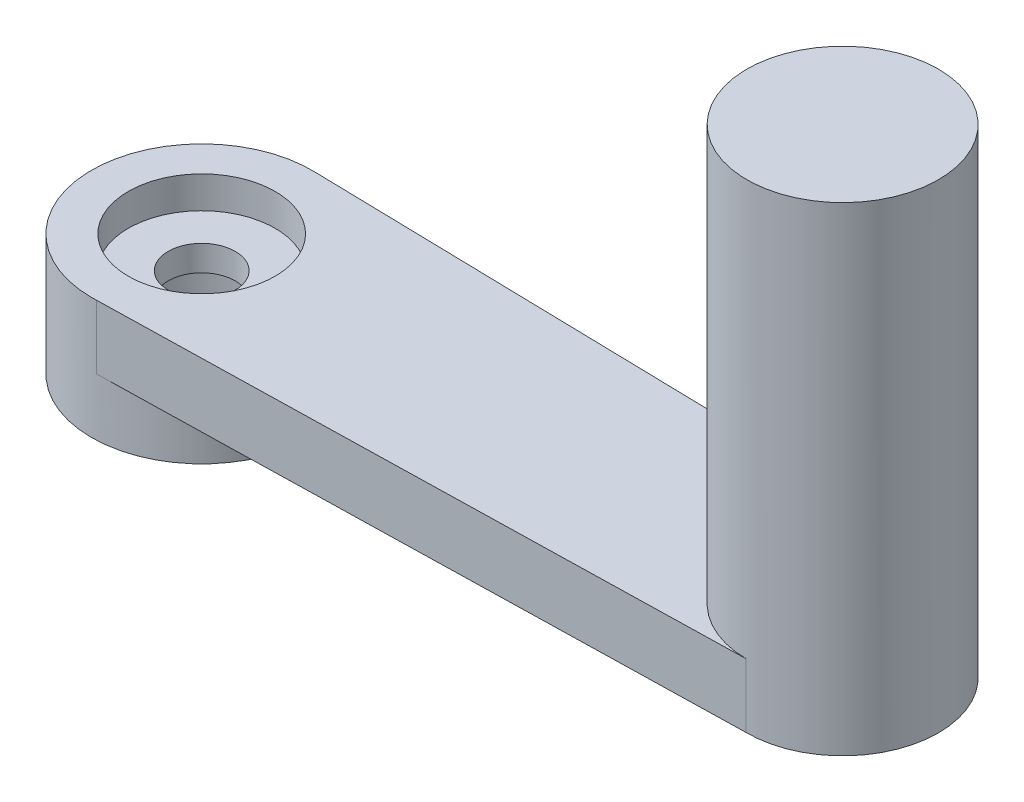
ISO-10303-21;
HEADER;
FILE_DESCRIPTION(('STEP AP214'),'2;1');
FILE_NAME('part.step','',(''),(''),'','','');
FILE_SCHEMA(('AUTOMOTIVE_DESIGN { 1 0 10303 214 1 1 1 1 }'));
ENDSEC;
DATA;
#1=APPLICATION_CONTEXT('core data for automotive mechanical design processes');
#2=APPLICATION_PROTOCOL_DEFINITION('international standard','automotive_design',2000,#1);
#3=PRODUCT_CONTEXT('',#1,'mechanical');
#4=PRODUCT('Part','Part','',(#3));
#5=PRODUCT_RELATED_PRODUCT_CATEGORY('part','',(#4));
#6=PRODUCT_DEFINITION_FORMATION('','',#4);
#7=PRODUCT_DEFINITION_CONTEXT('part definition',#1,'design');
#8=PRODUCT_DEFINITION('design','',#6,#7);
#9=PRODUCT_DEFINITION_SHAPE('','',#8);
#10=(LENGTH_UNIT() NAMED_UNIT(*) SI_UNIT(.MILLI.,.METRE.));
#11=(NAMED_UNIT(*) PLANE_ANGLE_UNIT() SI_UNIT($,.RADIAN.));
#12=(NAMED_UNIT(*) SI_UNIT($,.STERADIAN.) SOLID_ANGLE_UNIT());
#13=UNCERTAINTY_MEASURE_WITH_UNIT(LENGTH_MEASURE(1.E-05),#10,'distance_accuracy_value','');
#14=(GEOMETRIC_REPRESENTATION_CONTEXT(3) GLOBAL_UNCERTAINTY_ASSIGNED_CONTEXT((#13)) GLOBAL_UNIT_ASSIGNED_CONTEXT((#10,
#11,#12)) REPRESENTATION_CONTEXT('',''));
#15=CARTESIAN_POINT('',(0.,0.,0.));
#16=DIRECTION('',(0.,0.,1.));
#17=DIRECTION('',(1.,0.,0.));
#18=AXIS2_PLACEMENT_3D('',#15,#16,#17);
#19=CARTESIAN_POINT('',(0.,-1.4,0.));
#20=DIRECTION('',(0.,1.,0.));
#21=DIRECTION('',(0.,0.,1.));
#22=AXIS2_PLACEMENT_3D('',#19,#20,#21);
#23=CYLINDRICAL_SURFACE('',#22,3.45);
#24=DIRECTION('',(0.,1.,0.));
#25=VECTOR('',#24,1.);
#26=CARTESIAN_POINT('',(0.154910768884005,-2.,3.446520368964));
#27=LINE('',#26,#25);
#28=CARTESIAN_POINT('',(0.154910768884005,-2.,3.446520368964));
#29=VERTEX_POINT('',#28);
#30=CARTESIAN_POINT('',(0.154910768884005,0.,3.446520368964));
#31=VERTEX_POINT('',#30);
#32=EDGE_CURVE('E64',#29,#31,#27,.T.);
#33=ORIENTED_EDGE('',*,*,#32,.T.);
#34=CARTESIAN_POINT('',(0.,0.,0.));
#35=DIRECTION('',(0.,1.,0.));
#36=DIRECTION('',(0.,0.,1.));
#37=AXIS2_PLACEMENT_3D('',#34,#35,#36);
#38=CIRCLE('',#37,3.45);
#39=CARTESIAN_POINT('',(0.154910768884049,0.,-3.446520368964));
#40=VERTEX_POINT('',#39);
#41=EDGE_CURVE('E12',#40,#31,#38,.T.);
#42=ORIENTED_EDGE('',*,*,#41,.F.);
#43=DIRECTION('',(0.,1.,0.));
#44=VECTOR('',#43,1.);
#45=CARTESIAN_POINT('',(0.154910768884005,-2.,-3.446520368964));
#46=LINE('',#45,#44);
#47=CARTESIAN_POINT('',(0.154910768884005,-2.,-3.446520368964));
#48=VERTEX_POINT('',#47);
#49=EDGE_CURVE('E102',#48,#40,#46,.T.);
#50=ORIENTED_EDGE('',*,*,#49,.F.);
#51=CARTESIAN_POINT('',(0.,-2.,0.));
#52=DIRECTION('',(0.,1.,0.));
#53=DIRECTION('',(0.,0.,1.));
#54=AXIS2_PLACEMENT_3D('',#51,#52,#53);
#55=CIRCLE('',#54,3.45);
#56=EDGE_CURVE('E103',#29,#48,#55,.T.);
#57=ORIENTED_EDGE('',*,*,#56,.F.);
#58=EDGE_LOOP('',(#33,#42,#50,#57));
#59=FACE_BOUND('',#58,.T.);
#60=CARTESIAN_POINT('',(0.,-3.8,0.));
#61=DIRECTION('',(0.,1.,0.));
#62=DIRECTION('',(0.,0.,1.));
#63=AXIS2_PLACEMENT_3D('',#60,#61,#62);
#64=CIRCLE('',#63,3.45);
#65=CARTESIAN_POINT('',(0.,-3.8,3.45));
#66=VERTEX_POINT('',#65);
#67=EDGE_CURVE('E49',#66,#66,#64,.T.);
#68=ORIENTED_EDGE('',*,*,#67,.T.);
#69=EDGE_LOOP('',(#68));
#70=FACE_BOUND('',#69,.T.);
#71=ADVANCED_FACE('F41',(#59,#70),#23,.T.);
#72=CARTESIAN_POINT('',(0.,0.,0.));
#73=DIRECTION('',(0.,1.,0.));
#74=DIRECTION('',(0.,0.,1.));
#75=AXIS2_PLACEMENT_3D('',#72,#73,#74);
#76=PLANE('',#75);
#77=CARTESIAN_POINT('',(20.0673694973811,0.,0.));
#78=DIRECTION('',(0.,1.,0.));
#79=DIRECTION('',(0.,0.,1.));
#80=AXIS2_PLACEMENT_3D('',#77,#78,#79);
#81=CIRCLE('',#80,3.);
#82=CARTESIAN_POINT('',(20.0394661995052,0.,-2.9998702315213));
#83=VERTEX_POINT('',#82);
#84=CARTESIAN_POINT('',(20.0394661995052,0.,2.9998702315213));
#85=VERTEX_POINT('',#84);
#86=EDGE_CURVE('E79',#83,#85,#81,.T.);
#87=ORIENTED_EDGE('',*,*,#86,.F.);
#88=DIRECTION('',(0.999747821026361,0.,0.0224564991270473));
#89=VECTOR('',#88,1.);
#90=CARTESIAN_POINT('',(0.0774553844420034,0.,-3.448260184482));
#91=LINE('',#90,#89);
#92=EDGE_CURVE('E55',#40,#83,#91,.T.);
#93=ORIENTED_EDGE('',*,*,#92,.F.);
#94=ORIENTED_EDGE('',*,*,#41,.T.);
#95=DIRECTION('',(0.999747821026361,0.,-0.0224564991270473));
#96=VECTOR('',#95,1.);
#97=CARTESIAN_POINT('',(0.0774553844420034,0.,3.448260184482));
#98=LINE('',#97,#96);
#99=EDGE_CURVE('E73',#31,#85,#98,.T.);
#100=ORIENTED_EDGE('',*,*,#99,.T.);
#101=EDGE_LOOP('',(#87,#93,#94,#100));
#102=FACE_BOUND('',#101,.T.);
#103=CARTESIAN_POINT('',(0.,0.,0.));
#104=DIRECTION('',(0.,1.,0.));
#105=DIRECTION('',(0.,0.,1.));
#106=AXIS2_PLACEMENT_3D('',#103,#104,#105);
#107=CIRCLE('',#106,2.30000000000001);
#108=CARTESIAN_POINT('',(0.,0.,2.30000000000001));
#109=VERTEX_POINT('',#108);
#110=EDGE_CURVE('E115',#109,#109,#107,.T.);
#111=ORIENTED_EDGE('',*,*,#110,.F.);
#112=EDGE_LOOP('',(#111));
#113=FACE_BOUND('',#112,.T.);
#114=ADVANCED_FACE('F134',(#102,#113),#76,.T.);
#115=CARTESIAN_POINT('',(0.,-3.8,0.));
#116=DIRECTION('',(0.,1.,0.));
#117=DIRECTION('',(0.,0.,1.));
#118=AXIS2_PLACEMENT_3D('',#115,#116,#117);
#119=PLANE('',#118);
#120=CARTESIAN_POINT('',(0.,-3.8,0.));
#121=DIRECTION('',(0.,-1.,0.));
#122=DIRECTION('',(0.,0.,-1.));
#123=AXIS2_PLACEMENT_3D('',#120,#121,#122);
#124=CIRCLE('',#123,2.47500000000001);
#125=CARTESIAN_POINT('',(0.,-3.8,-2.47500000000001));
#126=VERTEX_POINT('',#125);
#127=EDGE_CURVE('E121',#126,#126,#124,.T.);
#128=ORIENTED_EDGE('',*,*,#127,.F.);
#129=EDGE_LOOP('',(#128));
#130=FACE_BOUND('',#129,.T.);
#131=ORIENTED_EDGE('',*,*,#67,.F.);
#132=EDGE_LOOP('',(#131));
#133=FACE_BOUND('',#132,.T.);
#134=ADVANCED_FACE('F131',(#130,#133),#119,.F.);
#135=CARTESIAN_POINT('',(0.,-1.8,0.));
#136=DIRECTION('',(0.,1.,0.));
#137=DIRECTION('',(0.,0.,1.));
#138=AXIS2_PLACEMENT_3D('',#135,#136,#137);
#139=PLANE('',#138);
#140=CARTESIAN_POINT('',(0.,-1.8,0.));
#141=DIRECTION('',(0.,1.,0.));
#142=DIRECTION('',(0.,0.,1.));
#143=AXIS2_PLACEMENT_3D('',#140,#141,#142);
#144=CIRCLE('',#143,1.05000000000001);
#145=CARTESIAN_POINT('',(0.,-1.8,1.05000000000001));
#146=VERTEX_POINT('',#145);
#147=EDGE_CURVE('E112',#146,#146,#144,.T.);
#148=ORIENTED_EDGE('',*,*,#147,.T.);
#149=EDGE_LOOP('',(#148));
#150=FACE_BOUND('',#149,.T.);
#151=CARTESIAN_POINT('',(0.,-1.8,0.));
#152=DIRECTION('',(0.,-1.,0.));
#153=DIRECTION('',(0.,0.,-1.));
#154=AXIS2_PLACEMENT_3D('',#151,#152,#153);
#155=CIRCLE('',#154,2.47500000000001);
#156=CARTESIAN_POINT('',(0.,-1.8,-2.47500000000001));
#157=VERTEX_POINT('',#156);
#158=EDGE_CURVE('E124',#157,#157,#155,.T.);
#159=ORIENTED_EDGE('',*,*,#158,.T.);
#160=EDGE_LOOP('',(#159));
#161=FACE_BOUND('',#160,.T.);
#162=ADVANCED_FACE('F133',(#150,#161),#139,.F.);
#163=CARTESIAN_POINT('',(0.,-3.8,0.));
#164=DIRECTION('',(0.,-1.,0.));
#165=DIRECTION('',(0.,0.,-1.));
#166=AXIS2_PLACEMENT_3D('',#163,#164,#165);
#167=CYLINDRICAL_SURFACE('',#166,2.47500000000001);
#168=ORIENTED_EDGE('',*,*,#158,.F.);
#169=EDGE_LOOP('',(#168));
#170=FACE_BOUND('',#169,.T.);
#171=ORIENTED_EDGE('',*,*,#127,.T.);
#172=EDGE_LOOP('',(#171));
#173=FACE_BOUND('',#172,.T.);
#174=ADVANCED_FACE('F141',(#170,#173),#167,.F.);
#175=CARTESIAN_POINT('',(0.,-1.,0.));
#176=DIRECTION('',(0.,-1.,0.));
#177=DIRECTION('',(0.,0.,-1.));
#178=AXIS2_PLACEMENT_3D('',#175,#176,#177);
#179=PLANE('',#178);
#180=CARTESIAN_POINT('',(0.,-1.,0.));
#181=DIRECTION('',(0.,-1.,0.));
#182=DIRECTION('',(0.,0.,-1.));
#183=AXIS2_PLACEMENT_3D('',#180,#181,#182);
#184=CIRCLE('',#183,1.05000000000001);
#185=CARTESIAN_POINT('',(0.,-1.,-1.05000000000001));
#186=VERTEX_POINT('',#185);
#187=EDGE_CURVE('E44',#186,#186,#184,.T.);
#188=ORIENTED_EDGE('',*,*,#187,.T.);
#189=EDGE_LOOP('',(#188));
#190=FACE_BOUND('',#189,.T.);
#191=CARTESIAN_POINT('',(0.,-1.,0.));
#192=DIRECTION('',(0.,1.,0.));
#193=DIRECTION('',(0.,0.,1.));
#194=AXIS2_PLACEMENT_3D('',#191,#192,#193);
#195=CIRCLE('',#194,2.30000000000001);
#196=CARTESIAN_POINT('',(0.,-1.,2.30000000000001));
#197=VERTEX_POINT('',#196);
#198=EDGE_CURVE('E118',#197,#197,#195,.T.);
#199=ORIENTED_EDGE('',*,*,#198,.T.);
#200=EDGE_LOOP('',(#199));
#201=FACE_BOUND('',#200,.T.);
#202=ADVANCED_FACE('F183',(#190,#201),#179,.F.);
#203=CARTESIAN_POINT('',(0.,0.,0.));
#204=DIRECTION('',(0.,1.,0.));
#205=DIRECTION('',(0.,0.,1.));
#206=AXIS2_PLACEMENT_3D('',#203,#204,#205);
#207=CYLINDRICAL_SURFACE('',#206,2.30000000000001);
#208=ORIENTED_EDGE('',*,*,#198,.F.);
#209=EDGE_LOOP('',(#208));
#210=FACE_BOUND('',#209,.T.);
#211=ORIENTED_EDGE('',*,*,#110,.T.);
#212=EDGE_LOOP('',(#211));
#213=FACE_BOUND('',#212,.T.);
#214=ADVANCED_FACE('F179',(#210,#213),#207,.F.);
#215=CARTESIAN_POINT('',(0.,0.,0.));
#216=DIRECTION('',(0.,1.,0.));
#217=DIRECTION('',(0.,0.,1.));
#218=AXIS2_PLACEMENT_3D('',#215,#216,#217);
#219=CYLINDRICAL_SURFACE('',#218,1.05000000000001);
#220=ORIENTED_EDGE('',*,*,#187,.F.);
#221=EDGE_LOOP('',(#220));
#222=FACE_BOUND('',#221,.T.);
#223=ORIENTED_EDGE('',*,*,#147,.F.);
#224=EDGE_LOOP('',(#223));
#225=FACE_BOUND('',#224,.T.);
#226=ADVANCED_FACE('F174',(#222,#225),#219,.F.);
#227=CARTESIAN_POINT('',(0.0774553844420034,-2.,3.448260184482));
#228=DIRECTION('',(0.0224564991270473,0.,0.999747821026361));
#229=DIRECTION('',(0.999747821026361,0.,-0.0224564991270473));
#230=AXIS2_PLACEMENT_3D('',#227,#228,#229);
#231=PLANE('',#230);
#232=DIRECTION('',(0.,-1.,0.));
#233=VECTOR('',#232,1.);
#234=CARTESIAN_POINT('',(20.0394661995052,13.,2.9998702315213));
#235=LINE('',#234,#233);
#236=CARTESIAN_POINT('',(20.0394661995052,-2.,2.9998702315213));
#237=VERTEX_POINT('',#236);
#238=EDGE_CURVE('E86',#85,#237,#235,.T.);
#239=ORIENTED_EDGE('',*,*,#238,.F.);
#240=ORIENTED_EDGE('',*,*,#99,.F.);
#241=ORIENTED_EDGE('',*,*,#32,.F.);
#242=DIRECTION('',(0.999747821026361,0.,-0.0224564991270473));
#243=VECTOR('',#242,1.);
#244=CARTESIAN_POINT('',(0.0774553844420034,-2.,3.448260184482));
#245=LINE('',#244,#243);
#246=EDGE_CURVE('E95',#29,#237,#245,.T.);
#247=ORIENTED_EDGE('',*,*,#246,.T.);
#248=EDGE_LOOP('',(#239,#240,#241,#247));
#249=FACE_BOUND('',#248,.T.);
#250=ADVANCED_FACE('F101',(#249),#231,.T.);
#251=CARTESIAN_POINT('',(0.0774553844420034,-2.,-3.448260184482));
#252=DIRECTION('',(-0.0224564991270473,0.,0.999747821026361));
#253=DIRECTION('',(0.999747821026361,0.,0.0224564991270473));
#254=AXIS2_PLACEMENT_3D('',#251,#252,#253);
#255=PLANE('',#254);
#256=ORIENTED_EDGE('',*,*,#92,.T.);
#257=DIRECTION('',(0.,-1.,0.));
#258=VECTOR('',#257,1.);
#259=CARTESIAN_POINT('',(20.0394661995052,13.,-2.9998702315213));
#260=LINE('',#259,#258);
#261=CARTESIAN_POINT('',(20.0394661995052,-2.,-2.9998702315213));
#262=VERTEX_POINT('',#261);
#263=EDGE_CURVE('E152',#83,#262,#260,.T.);
#264=ORIENTED_EDGE('',*,*,#263,.T.);
#265=DIRECTION('',(0.999747821026361,0.,0.0224564991270473));
#266=VECTOR('',#265,1.);
#267=CARTESIAN_POINT('',(0.0774553844420034,-2.,-3.448260184482));
#268=LINE('',#267,#266);
#269=EDGE_CURVE('E98',#48,#262,#268,.T.);
#270=ORIENTED_EDGE('',*,*,#269,.F.);
#271=ORIENTED_EDGE('',*,*,#49,.T.);
#272=EDGE_LOOP('',(#256,#264,#270,#271));
#273=FACE_BOUND('',#272,.T.);
#274=ADVANCED_FACE('F155',(#273),#255,.F.);
#275=CARTESIAN_POINT('',(0.,-2.,0.));
#276=DIRECTION('',(0.,1.,0.));
#277=DIRECTION('',(0.,0.,1.));
#278=AXIS2_PLACEMENT_3D('',#275,#276,#277);
#279=PLANE('',#278);
#280=ORIENTED_EDGE('',*,*,#269,.T.);
#281=CARTESIAN_POINT('',(20.0673694973811,-2.,0.));
#282=DIRECTION('',(0.,-1.,0.));
#283=DIRECTION('',(0.,0.,-1.));
#284=AXIS2_PLACEMENT_3D('',#281,#282,#283);
#285=CIRCLE('',#284,3.);
#286=EDGE_CURVE('E89',#262,#237,#285,.T.);
#287=ORIENTED_EDGE('',*,*,#286,.T.);
#288=ORIENTED_EDGE('',*,*,#246,.F.);
#289=ORIENTED_EDGE('',*,*,#56,.T.);
#290=EDGE_LOOP('',(#280,#287,#288,#289));
#291=FACE_BOUND('',#290,.T.);
#292=ADVANCED_FACE('F94',(#291),#279,.F.);
#293=CARTESIAN_POINT('',(20.0673694973811,13.,0.));
#294=DIRECTION('',(0.,-1.,0.));
#295=DIRECTION('',(0.,0.,-1.));
#296=AXIS2_PLACEMENT_3D('',#293,#294,#295);
#297=CYLINDRICAL_SURFACE('',#296,3.);
#298=CARTESIAN_POINT('',(20.0673694973811,13.,0.));
#299=DIRECTION('',(0.,-1.,0.));
#300=DIRECTION('',(0.,0.,-1.));
#301=AXIS2_PLACEMENT_3D('',#298,#299,#300);
#302=CIRCLE('',#301,3.);
#303=CARTESIAN_POINT('',(20.0673694973811,13.,-3.));
#304=VERTEX_POINT('',#303);
#305=EDGE_CURVE('E99',#304,#304,#302,.T.);
#306=ORIENTED_EDGE('',*,*,#305,.T.);
#307=EDGE_LOOP('',(#306));
#308=FACE_BOUND('',#307,.T.);
#309=ORIENTED_EDGE('',*,*,#86,.T.);
#310=ORIENTED_EDGE('',*,*,#238,.T.);
#311=ORIENTED_EDGE('',*,*,#286,.F.);
#312=ORIENTED_EDGE('',*,*,#263,.F.);
#313=EDGE_LOOP('',(#309,#310,#311,#312));
#314=FACE_BOUND('',#313,.T.);
#315=ADVANCED_FACE('F88',(#308,#314),#297,.T.);
#316=CARTESIAN_POINT('',(20.0673694973811,13.,0.));
#317=DIRECTION('',(0.,-1.,0.));
#318=DIRECTION('',(0.,0.,-1.));
#319=AXIS2_PLACEMENT_3D('',#316,#317,#318);
#320=PLANE('',#319);
#321=ORIENTED_EDGE('',*,*,#305,.F.);
#322=EDGE_LOOP('',(#321));
#323=FACE_BOUND('',#322,.T.);
#324=ADVANCED_FACE('F162',(#323),#320,.F.);
#325=CLOSED_SHELL('',(#71,#114,#134,#162,#174,#202,#214,#226,#250,#274,#292,#315,#324));
#326=MANIFOLD_SOLID_BREP('B2',#325);
#327=ADVANCED_BREP_SHAPE_REPRESENTATION('',(#18,#326),#14);
#328=SHAPE_DEFINITION_REPRESENTATION(#9,#327);
ENDSEC;
END-ISO-10303-21;
